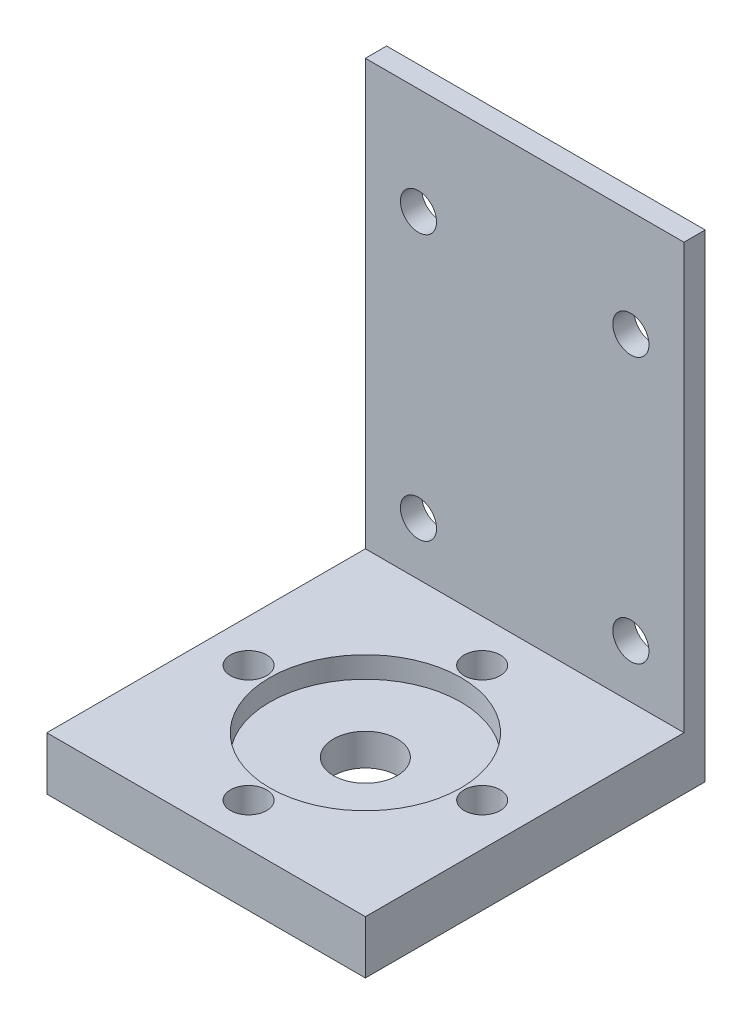
ISO-10303-21;
HEADER;
FILE_DESCRIPTION(('STEP AP214'),'2;1');
FILE_NAME('part.step','',(''),(''),'','','');
FILE_SCHEMA(('AUTOMOTIVE_DESIGN { 1 0 10303 214 1 1 1 1 }'));
ENDSEC;
DATA;
#1=APPLICATION_CONTEXT('core data for automotive mechanical design processes');
#2=APPLICATION_PROTOCOL_DEFINITION('international standard','automotive_design',2000,#1);
#3=PRODUCT_CONTEXT('',#1,'mechanical');
#4=PRODUCT('Part','Part','',(#3));
#5=PRODUCT_RELATED_PRODUCT_CATEGORY('part','',(#4));
#6=PRODUCT_DEFINITION_FORMATION('','',#4);
#7=PRODUCT_DEFINITION_CONTEXT('part definition',#1,'design');
#8=PRODUCT_DEFINITION('design','',#6,#7);
#9=PRODUCT_DEFINITION_SHAPE('','',#8);
#10=(LENGTH_UNIT() NAMED_UNIT(*) SI_UNIT(.MILLI.,.METRE.));
#11=(NAMED_UNIT(*) PLANE_ANGLE_UNIT() SI_UNIT($,.RADIAN.));
#12=(NAMED_UNIT(*) SI_UNIT($,.STERADIAN.) SOLID_ANGLE_UNIT());
#13=UNCERTAINTY_MEASURE_WITH_UNIT(LENGTH_MEASURE(1.E-05),#10,'distance_accuracy_value','');
#14=(GEOMETRIC_REPRESENTATION_CONTEXT(3) GLOBAL_UNCERTAINTY_ASSIGNED_CONTEXT((#13)) GLOBAL_UNIT_ASSIGNED_CONTEXT((#10,
#11,#12)) REPRESENTATION_CONTEXT('',''));
#15=CARTESIAN_POINT('',(0.,0.,0.));
#16=DIRECTION('',(0.,0.,1.));
#17=DIRECTION('',(1.,0.,0.));
#18=AXIS2_PLACEMENT_3D('',#15,#16,#17);
#19=CARTESIAN_POINT('',(30.,5.,0.));
#20=DIRECTION('',(0.,0.,-1.));
#21=DIRECTION('',(0.,1.,0.));
#22=AXIS2_PLACEMENT_3D('',#19,#20,#21);
#23=PLANE('',#22);
#24=DIRECTION('',(0.,-1.,0.));
#25=VECTOR('',#24,1.);
#26=CARTESIAN_POINT('',(0.,5.,0.));
#27=LINE('',#26,#25);
#28=CARTESIAN_POINT('',(0.,5.,0.));
#29=VERTEX_POINT('',#28);
#30=CARTESIAN_POINT('',(0.,0.,0.));
#31=VERTEX_POINT('',#30);
#32=EDGE_CURVE('E134',#29,#31,#27,.T.);
#33=ORIENTED_EDGE('',*,*,#32,.T.);
#34=DIRECTION('',(-1.,0.,0.));
#35=VECTOR('',#34,1.);
#36=CARTESIAN_POINT('',(30.,0.,0.));
#37=LINE('',#36,#35);
#38=CARTESIAN_POINT('',(30.,0.,0.));
#39=VERTEX_POINT('',#38);
#40=EDGE_CURVE('E11',#39,#31,#37,.T.);
#41=ORIENTED_EDGE('',*,*,#40,.F.);
#42=DIRECTION('',(0.,-1.,0.));
#43=VECTOR('',#42,1.);
#44=CARTESIAN_POINT('',(30.,5.,0.));
#45=LINE('',#44,#43);
#46=CARTESIAN_POINT('',(30.,5.,0.));
#47=VERTEX_POINT('',#46);
#48=EDGE_CURVE('E151',#47,#39,#45,.T.);
#49=ORIENTED_EDGE('',*,*,#48,.F.);
#50=DIRECTION('',(-1.,0.,0.));
#51=VECTOR('',#50,1.);
#52=CARTESIAN_POINT('',(30.,5.,0.));
#53=LINE('',#52,#51);
#54=EDGE_CURVE('E130',#47,#29,#53,.T.);
#55=ORIENTED_EDGE('',*,*,#54,.T.);
#56=EDGE_LOOP('',(#33,#41,#49,#55));
#57=FACE_BOUND('',#56,.T.);
#58=ADVANCED_FACE('F45',(#57),#23,.F.);
#59=CARTESIAN_POINT('',(30.,0.,0.));
#60=DIRECTION('',(0.,1.,0.));
#61=DIRECTION('',(0.,0.,1.));
#62=AXIS2_PLACEMENT_3D('',#59,#60,#61);
#63=PLANE('',#62);
#64=CARTESIAN_POINT('',(4.,0.,-15.));
#65=DIRECTION('',(0.,1.,0.));
#66=DIRECTION('',(0.,0.,1.));
#67=AXIS2_PLACEMENT_3D('',#64,#65,#66);
#68=CIRCLE('',#67,1.7);
#69=CARTESIAN_POINT('',(4.,0.,-13.3));
#70=VERTEX_POINT('',#69);
#71=EDGE_CURVE('E351',#70,#70,#68,.T.);
#72=ORIENTED_EDGE('',*,*,#71,.T.);
#73=EDGE_LOOP('',(#72));
#74=FACE_BOUND('',#73,.T.);
#75=CARTESIAN_POINT('',(15.,0.,-26.));
#76=DIRECTION('',(0.,1.,0.));
#77=DIRECTION('',(0.,0.,1.));
#78=AXIS2_PLACEMENT_3D('',#75,#76,#77);
#79=CIRCLE('',#78,1.7);
#80=CARTESIAN_POINT('',(15.,0.,-24.3));
#81=VERTEX_POINT('',#80);
#82=EDGE_CURVE('E355',#81,#81,#79,.T.);
#83=ORIENTED_EDGE('',*,*,#82,.T.);
#84=EDGE_LOOP('',(#83));
#85=FACE_BOUND('',#84,.T.);
#86=CARTESIAN_POINT('',(26.,0.,-15.));
#87=DIRECTION('',(0.,1.,0.));
#88=DIRECTION('',(0.,0.,1.));
#89=AXIS2_PLACEMENT_3D('',#86,#87,#88);
#90=CIRCLE('',#89,1.7);
#91=CARTESIAN_POINT('',(26.,0.,-13.3));
#92=VERTEX_POINT('',#91);
#93=EDGE_CURVE('E364',#92,#92,#90,.T.);
#94=ORIENTED_EDGE('',*,*,#93,.T.);
#95=EDGE_LOOP('',(#94));
#96=FACE_BOUND('',#95,.T.);
#97=CARTESIAN_POINT('',(15.,0.,-4.));
#98=DIRECTION('',(0.,1.,0.));
#99=DIRECTION('',(0.,0.,1.));
#100=AXIS2_PLACEMENT_3D('',#97,#98,#99);
#101=CIRCLE('',#100,1.7);
#102=CARTESIAN_POINT('',(15.,0.,-2.3));
#103=VERTEX_POINT('',#102);
#104=EDGE_CURVE('E372',#103,#103,#101,.T.);
#105=ORIENTED_EDGE('',*,*,#104,.T.);
#106=EDGE_LOOP('',(#105));
#107=FACE_BOUND('',#106,.T.);
#108=CARTESIAN_POINT('',(15.,0.,-15.));
#109=DIRECTION('',(0.,1.,0.));
#110=DIRECTION('',(0.,0.,1.));
#111=AXIS2_PLACEMENT_3D('',#108,#109,#110);
#112=CIRCLE('',#111,3.);
#113=CARTESIAN_POINT('',(15.,0.,-12.));
#114=VERTEX_POINT('',#113);
#115=EDGE_CURVE('E359',#114,#114,#112,.T.);
#116=ORIENTED_EDGE('',*,*,#115,.T.);
#117=EDGE_LOOP('',(#116));
#118=FACE_BOUND('',#117,.T.);
#119=DIRECTION('',(0.,0.,-1.));
#120=VECTOR('',#119,1.);
#121=CARTESIAN_POINT('',(0.,0.,0.));
#122=LINE('',#121,#120);
#123=CARTESIAN_POINT('',(0.,0.,-32.));
#124=VERTEX_POINT('',#123);
#125=EDGE_CURVE('E138',#31,#124,#122,.T.);
#126=ORIENTED_EDGE('',*,*,#125,.T.);
#127=DIRECTION('',(-1.,0.,0.));
#128=VECTOR('',#127,1.);
#129=CARTESIAN_POINT('',(30.,0.,-32.));
#130=LINE('',#129,#128);
#131=CARTESIAN_POINT('',(30.,0.,-32.));
#132=VERTEX_POINT('',#131);
#133=EDGE_CURVE('E54',#132,#124,#130,.T.);
#134=ORIENTED_EDGE('',*,*,#133,.F.);
#135=DIRECTION('',(0.,0.,-1.));
#136=VECTOR('',#135,1.);
#137=CARTESIAN_POINT('',(30.,0.,0.));
#138=LINE('',#137,#136);
#139=EDGE_CURVE('E99',#39,#132,#138,.T.);
#140=ORIENTED_EDGE('',*,*,#139,.F.);
#141=ORIENTED_EDGE('',*,*,#40,.T.);
#142=EDGE_LOOP('',(#126,#134,#140,#141));
#143=FACE_BOUND('',#142,.T.);
#144=ADVANCED_FACE('F185',(#74,#85,#96,#107,#118,#143),#63,.F.);
#145=CARTESIAN_POINT('',(30.,0.,-32.));
#146=DIRECTION('',(0.,0.,1.));
#147=DIRECTION('',(0.,-1.,0.));
#148=AXIS2_PLACEMENT_3D('',#145,#146,#147);
#149=PLANE('',#148);
#150=CARTESIAN_POINT('',(5.,10.,-32.));
#151=DIRECTION('',(0.,0.,1.));
#152=DIRECTION('',(1.,0.,0.));
#153=AXIS2_PLACEMENT_3D('',#150,#151,#152);
#154=CIRCLE('',#153,1.7);
#155=CARTESIAN_POINT('',(6.7,10.,-32.));
#156=VERTEX_POINT('',#155);
#157=EDGE_CURVE('E326',#156,#156,#154,.T.);
#158=ORIENTED_EDGE('',*,*,#157,.T.);
#159=EDGE_LOOP('',(#158));
#160=FACE_BOUND('',#159,.T.);
#161=CARTESIAN_POINT('',(25.,10.,-32.));
#162=DIRECTION('',(0.,0.,1.));
#163=DIRECTION('',(1.,0.,0.));
#164=AXIS2_PLACEMENT_3D('',#161,#162,#163);
#165=CIRCLE('',#164,1.7);
#166=CARTESIAN_POINT('',(26.7,10.,-32.));
#167=VERTEX_POINT('',#166);
#168=EDGE_CURVE('E331',#167,#167,#165,.T.);
#169=ORIENTED_EDGE('',*,*,#168,.T.);
#170=EDGE_LOOP('',(#169));
#171=FACE_BOUND('',#170,.T.);
#172=CARTESIAN_POINT('',(25.,35.,-32.));
#173=DIRECTION('',(0.,0.,1.));
#174=DIRECTION('',(1.,0.,0.));
#175=AXIS2_PLACEMENT_3D('',#172,#173,#174);
#176=CIRCLE('',#175,1.7);
#177=CARTESIAN_POINT('',(26.7,35.,-32.));
#178=VERTEX_POINT('',#177);
#179=EDGE_CURVE('E403',#178,#178,#176,.T.);
#180=ORIENTED_EDGE('',*,*,#179,.T.);
#181=EDGE_LOOP('',(#180));
#182=FACE_BOUND('',#181,.T.);
#183=CARTESIAN_POINT('',(5.,35.,-32.));
#184=DIRECTION('',(0.,0.,1.));
#185=DIRECTION('',(1.,0.,0.));
#186=AXIS2_PLACEMENT_3D('',#183,#184,#185);
#187=CIRCLE('',#186,1.7);
#188=CARTESIAN_POINT('',(6.7,35.,-32.));
#189=VERTEX_POINT('',#188);
#190=EDGE_CURVE('E341',#189,#189,#187,.T.);
#191=ORIENTED_EDGE('',*,*,#190,.T.);
#192=EDGE_LOOP('',(#191));
#193=FACE_BOUND('',#192,.T.);
#194=DIRECTION('',(0.,1.,0.));
#195=VECTOR('',#194,1.);
#196=CARTESIAN_POINT('',(0.,0.,-32.));
#197=LINE('',#196,#195);
#198=CARTESIAN_POINT('',(0.,45.,-32.));
#199=VERTEX_POINT('',#198);
#200=EDGE_CURVE('E142',#124,#199,#197,.T.);
#201=ORIENTED_EDGE('',*,*,#200,.T.);
#202=DIRECTION('',(-1.,0.,0.));
#203=VECTOR('',#202,1.);
#204=CARTESIAN_POINT('',(30.,45.,-32.));
#205=LINE('',#204,#203);
#206=CARTESIAN_POINT('',(30.,45.,-32.));
#207=VERTEX_POINT('',#206);
#208=EDGE_CURVE('E123',#207,#199,#205,.T.);
#209=ORIENTED_EDGE('',*,*,#208,.F.);
#210=DIRECTION('',(0.,1.,0.));
#211=VECTOR('',#210,1.);
#212=CARTESIAN_POINT('',(30.,0.,-32.));
#213=LINE('',#212,#211);
#214=EDGE_CURVE('E112',#132,#207,#213,.T.);
#215=ORIENTED_EDGE('',*,*,#214,.F.);
#216=ORIENTED_EDGE('',*,*,#133,.T.);
#217=EDGE_LOOP('',(#201,#209,#215,#216));
#218=FACE_BOUND('',#217,.T.);
#219=ADVANCED_FACE('F161',(#160,#171,#182,#193,#218),#149,.F.);
#220=CARTESIAN_POINT('',(30.,45.,-32.));
#221=DIRECTION('',(0.,-1.,0.));
#222=DIRECTION('',(0.,0.,-1.));
#223=AXIS2_PLACEMENT_3D('',#220,#221,#222);
#224=PLANE('',#223);
#225=DIRECTION('',(0.,0.,1.));
#226=VECTOR('',#225,1.);
#227=CARTESIAN_POINT('',(0.,45.,-32.));
#228=LINE('',#227,#226);
#229=CARTESIAN_POINT('',(0.,45.,-30.));
#230=VERTEX_POINT('',#229);
#231=EDGE_CURVE('E121',#199,#230,#228,.T.);
#232=ORIENTED_EDGE('',*,*,#231,.T.);
#233=DIRECTION('',(-1.,0.,0.));
#234=VECTOR('',#233,1.);
#235=CARTESIAN_POINT('',(30.,45.,-30.));
#236=LINE('',#235,#234);
#237=CARTESIAN_POINT('',(30.,45.,-30.));
#238=VERTEX_POINT('',#237);
#239=EDGE_CURVE('E118',#238,#230,#236,.T.);
#240=ORIENTED_EDGE('',*,*,#239,.F.);
#241=DIRECTION('',(0.,0.,1.));
#242=VECTOR('',#241,1.);
#243=CARTESIAN_POINT('',(30.,45.,-32.));
#244=LINE('',#243,#242);
#245=EDGE_CURVE('E106',#207,#238,#244,.T.);
#246=ORIENTED_EDGE('',*,*,#245,.F.);
#247=ORIENTED_EDGE('',*,*,#208,.T.);
#248=EDGE_LOOP('',(#232,#240,#246,#247));
#249=FACE_BOUND('',#248,.T.);
#250=ADVANCED_FACE('F119',(#249),#224,.F.);
#251=CARTESIAN_POINT('',(30.,45.,-30.));
#252=DIRECTION('',(0.,0.,-1.));
#253=DIRECTION('',(0.,1.,0.));
#254=AXIS2_PLACEMENT_3D('',#251,#252,#253);
#255=PLANE('',#254);
#256=CARTESIAN_POINT('',(5.,10.,-30.));
#257=DIRECTION('',(0.,0.,1.));
#258=DIRECTION('',(1.,0.,0.));
#259=AXIS2_PLACEMENT_3D('',#256,#257,#258);
#260=CIRCLE('',#259,1.7);
#261=CARTESIAN_POINT('',(6.7,10.,-30.));
#262=VERTEX_POINT('',#261);
#263=EDGE_CURVE('E329',#262,#262,#260,.T.);
#264=ORIENTED_EDGE('',*,*,#263,.F.);
#265=EDGE_LOOP('',(#264));
#266=FACE_BOUND('',#265,.T.);
#267=CARTESIAN_POINT('',(25.,10.,-30.));
#268=DIRECTION('',(0.,0.,1.));
#269=DIRECTION('',(1.,0.,0.));
#270=AXIS2_PLACEMENT_3D('',#267,#268,#269);
#271=CIRCLE('',#270,1.7);
#272=CARTESIAN_POINT('',(26.7,10.,-30.));
#273=VERTEX_POINT('',#272);
#274=EDGE_CURVE('E336',#273,#273,#271,.T.);
#275=ORIENTED_EDGE('',*,*,#274,.F.);
#276=EDGE_LOOP('',(#275));
#277=FACE_BOUND('',#276,.T.);
#278=CARTESIAN_POINT('',(25.,35.,-30.));
#279=DIRECTION('',(0.,0.,1.));
#280=DIRECTION('',(1.,0.,0.));
#281=AXIS2_PLACEMENT_3D('',#278,#279,#280);
#282=CIRCLE('',#281,1.7);
#283=CARTESIAN_POINT('',(26.7,35.,-30.));
#284=VERTEX_POINT('',#283);
#285=EDGE_CURVE('E350',#284,#284,#282,.T.);
#286=ORIENTED_EDGE('',*,*,#285,.F.);
#287=EDGE_LOOP('',(#286));
#288=FACE_BOUND('',#287,.T.);
#289=CARTESIAN_POINT('',(5.,35.,-30.));
#290=DIRECTION('',(0.,0.,1.));
#291=DIRECTION('',(1.,0.,0.));
#292=AXIS2_PLACEMENT_3D('',#289,#290,#291);
#293=CIRCLE('',#292,1.7);
#294=CARTESIAN_POINT('',(6.7,35.,-30.));
#295=VERTEX_POINT('',#294);
#296=EDGE_CURVE('E346',#295,#295,#293,.T.);
#297=ORIENTED_EDGE('',*,*,#296,.F.);
#298=EDGE_LOOP('',(#297));
#299=FACE_BOUND('',#298,.T.);
#300=DIRECTION('',(0.,-1.,0.));
#301=VECTOR('',#300,1.);
#302=CARTESIAN_POINT('',(0.,45.,-30.));
#303=LINE('',#302,#301);
#304=CARTESIAN_POINT('',(0.,5.,-30.));
#305=VERTEX_POINT('',#304);
#306=EDGE_CURVE('E85',#230,#305,#303,.T.);
#307=ORIENTED_EDGE('',*,*,#306,.T.);
#308=DIRECTION('',(-1.,0.,0.));
#309=VECTOR('',#308,1.);
#310=CARTESIAN_POINT('',(30.,5.,-30.));
#311=LINE('',#310,#309);
#312=CARTESIAN_POINT('',(30.,5.,-30.));
#313=VERTEX_POINT('',#312);
#314=EDGE_CURVE('E124',#313,#305,#311,.T.);
#315=ORIENTED_EDGE('',*,*,#314,.F.);
#316=DIRECTION('',(0.,-1.,0.));
#317=VECTOR('',#316,1.);
#318=CARTESIAN_POINT('',(30.,45.,-30.));
#319=LINE('',#318,#317);
#320=EDGE_CURVE('E110',#238,#313,#319,.T.);
#321=ORIENTED_EDGE('',*,*,#320,.F.);
#322=ORIENTED_EDGE('',*,*,#239,.T.);
#323=EDGE_LOOP('',(#307,#315,#321,#322));
#324=FACE_BOUND('',#323,.T.);
#325=ADVANCED_FACE('F126',(#266,#277,#288,#299,#324),#255,.F.);
#326=CARTESIAN_POINT('',(30.,5.,-30.));
#327=DIRECTION('',(0.,-1.,0.));
#328=DIRECTION('',(0.,0.,-1.));
#329=AXIS2_PLACEMENT_3D('',#326,#327,#328);
#330=PLANE('',#329);
#331=CARTESIAN_POINT('',(4.,5.,-15.));
#332=DIRECTION('',(0.,1.,0.));
#333=DIRECTION('',(0.,0.,1.));
#334=AXIS2_PLACEMENT_3D('',#331,#332,#333);
#335=CIRCLE('',#334,1.7);
#336=CARTESIAN_POINT('',(4.,5.,-13.3));
#337=VERTEX_POINT('',#336);
#338=EDGE_CURVE('E354',#337,#337,#335,.T.);
#339=ORIENTED_EDGE('',*,*,#338,.F.);
#340=EDGE_LOOP('',(#339));
#341=FACE_BOUND('',#340,.T.);
#342=CARTESIAN_POINT('',(15.,5.,-26.));
#343=DIRECTION('',(0.,1.,0.));
#344=DIRECTION('',(0.,0.,1.));
#345=AXIS2_PLACEMENT_3D('',#342,#343,#344);
#346=CIRCLE('',#345,1.7);
#347=CARTESIAN_POINT('',(15.,5.,-24.3));
#348=VERTEX_POINT('',#347);
#349=EDGE_CURVE('E360',#348,#348,#346,.T.);
#350=ORIENTED_EDGE('',*,*,#349,.F.);
#351=EDGE_LOOP('',(#350));
#352=FACE_BOUND('',#351,.T.);
#353=CARTESIAN_POINT('',(26.,5.,-15.));
#354=DIRECTION('',(0.,1.,0.));
#355=DIRECTION('',(0.,0.,1.));
#356=AXIS2_PLACEMENT_3D('',#353,#354,#355);
#357=CIRCLE('',#356,1.7);
#358=CARTESIAN_POINT('',(26.,5.,-13.3));
#359=VERTEX_POINT('',#358);
#360=EDGE_CURVE('E368',#359,#359,#357,.T.);
#361=ORIENTED_EDGE('',*,*,#360,.F.);
#362=EDGE_LOOP('',(#361));
#363=FACE_BOUND('',#362,.T.);
#364=CARTESIAN_POINT('',(15.,5.,-4.));
#365=DIRECTION('',(0.,1.,0.));
#366=DIRECTION('',(0.,0.,1.));
#367=AXIS2_PLACEMENT_3D('',#364,#365,#366);
#368=CIRCLE('',#367,1.7);
#369=CARTESIAN_POINT('',(15.,5.,-2.3));
#370=VERTEX_POINT('',#369);
#371=EDGE_CURVE('E345',#370,#370,#368,.T.);
#372=ORIENTED_EDGE('',*,*,#371,.F.);
#373=EDGE_LOOP('',(#372));
#374=FACE_BOUND('',#373,.T.);
#375=CARTESIAN_POINT('',(15.,5.,-15.));
#376=DIRECTION('',(0.,1.,0.));
#377=DIRECTION('',(0.,0.,1.));
#378=AXIS2_PLACEMENT_3D('',#375,#376,#377);
#379=CIRCLE('',#378,9.);
#380=CARTESIAN_POINT('',(15.,5.,-6.));
#381=VERTEX_POINT('',#380);
#382=EDGE_CURVE('E389',#381,#381,#379,.T.);
#383=ORIENTED_EDGE('',*,*,#382,.F.);
#384=EDGE_LOOP('',(#383));
#385=FACE_BOUND('',#384,.T.);
#386=DIRECTION('',(0.,0.,1.));
#387=VECTOR('',#386,1.);
#388=CARTESIAN_POINT('',(0.,5.,-30.));
#389=LINE('',#388,#387);
#390=EDGE_CURVE('E91',#305,#29,#389,.T.);
#391=ORIENTED_EDGE('',*,*,#390,.T.);
#392=ORIENTED_EDGE('',*,*,#54,.F.);
#393=DIRECTION('',(0.,0.,1.));
#394=VECTOR('',#393,1.);
#395=CARTESIAN_POINT('',(30.,5.,-30.));
#396=LINE('',#395,#394);
#397=EDGE_CURVE('E62',#313,#47,#396,.T.);
#398=ORIENTED_EDGE('',*,*,#397,.F.);
#399=ORIENTED_EDGE('',*,*,#314,.T.);
#400=EDGE_LOOP('',(#391,#392,#398,#399));
#401=FACE_BOUND('',#400,.T.);
#402=ADVANCED_FACE('F168',(#341,#352,#363,#374,#385,#401),#330,.F.);
#403=CARTESIAN_POINT('',(30.,0.,0.));
#404=DIRECTION('',(1.,0.,0.));
#405=DIRECTION('',(0.,0.,-1.));
#406=AXIS2_PLACEMENT_3D('',#403,#404,#405);
#407=PLANE('',#406);
#408=ORIENTED_EDGE('',*,*,#48,.T.);
#409=ORIENTED_EDGE('',*,*,#139,.T.);
#410=ORIENTED_EDGE('',*,*,#214,.T.);
#411=ORIENTED_EDGE('',*,*,#245,.T.);
#412=ORIENTED_EDGE('',*,*,#320,.T.);
#413=ORIENTED_EDGE('',*,*,#397,.T.);
#414=EDGE_LOOP('',(#408,#409,#410,#411,#412,#413));
#415=FACE_BOUND('',#414,.T.);
#416=ADVANCED_FACE('F108',(#415),#407,.T.);
#417=CARTESIAN_POINT('',(0.,0.,0.));
#418=DIRECTION('',(1.,0.,0.));
#419=DIRECTION('',(0.,0.,-1.));
#420=AXIS2_PLACEMENT_3D('',#417,#418,#419);
#421=PLANE('',#420);
#422=ORIENTED_EDGE('',*,*,#32,.F.);
#423=ORIENTED_EDGE('',*,*,#390,.F.);
#424=ORIENTED_EDGE('',*,*,#306,.F.);
#425=ORIENTED_EDGE('',*,*,#231,.F.);
#426=ORIENTED_EDGE('',*,*,#200,.F.);
#427=ORIENTED_EDGE('',*,*,#125,.F.);
#428=EDGE_LOOP('',(#422,#423,#424,#425,#426,#427));
#429=FACE_BOUND('',#428,.T.);
#430=ADVANCED_FACE('F164',(#429),#421,.F.);
#431=CARTESIAN_POINT('',(15.,3.,-15.));
#432=DIRECTION('',(0.,1.,0.));
#433=DIRECTION('',(0.,0.,1.));
#434=AXIS2_PLACEMENT_3D('',#431,#432,#433);
#435=CYLINDRICAL_SURFACE('',#434,9.);
#436=CARTESIAN_POINT('',(15.,3.,-15.));
#437=DIRECTION('',(0.,1.,0.));
#438=DIRECTION('',(0.,0.,1.));
#439=AXIS2_PLACEMENT_3D('',#436,#437,#438);
#440=CIRCLE('',#439,9.);
#441=CARTESIAN_POINT('',(15.,3.,-6.));
#442=VERTEX_POINT('',#441);
#443=EDGE_CURVE('E139',#442,#442,#440,.T.);
#444=ORIENTED_EDGE('',*,*,#443,.F.);
#445=EDGE_LOOP('',(#444));
#446=FACE_BOUND('',#445,.T.);
#447=ORIENTED_EDGE('',*,*,#382,.T.);
#448=EDGE_LOOP('',(#447));
#449=FACE_BOUND('',#448,.T.);
#450=ADVANCED_FACE('F215',(#446,#449),#435,.F.);
#451=CARTESIAN_POINT('',(15.,3.,-15.));
#452=DIRECTION('',(0.,1.,0.));
#453=DIRECTION('',(0.,0.,1.));
#454=AXIS2_PLACEMENT_3D('',#451,#452,#453);
#455=PLANE('',#454);
#456=CARTESIAN_POINT('',(15.,3.,-15.));
#457=DIRECTION('',(0.,1.,0.));
#458=DIRECTION('',(0.,0.,1.));
#459=AXIS2_PLACEMENT_3D('',#456,#457,#458);
#460=CIRCLE('',#459,3.);
#461=CARTESIAN_POINT('',(15.,3.,-12.));
#462=VERTEX_POINT('',#461);
#463=EDGE_CURVE('E385',#462,#462,#460,.T.);
#464=ORIENTED_EDGE('',*,*,#463,.F.);
#465=EDGE_LOOP('',(#464));
#466=FACE_BOUND('',#465,.T.);
#467=ORIENTED_EDGE('',*,*,#443,.T.);
#468=EDGE_LOOP('',(#467));
#469=FACE_BOUND('',#468,.T.);
#470=ADVANCED_FACE('F222',(#466,#469),#455,.T.);
#471=CARTESIAN_POINT('',(15.,0.,-15.));
#472=DIRECTION('',(0.,1.,0.));
#473=DIRECTION('',(0.,0.,1.));
#474=AXIS2_PLACEMENT_3D('',#471,#472,#473);
#475=CYLINDRICAL_SURFACE('',#474,3.);
#476=ORIENTED_EDGE('',*,*,#463,.T.);
#477=EDGE_LOOP('',(#476));
#478=FACE_BOUND('',#477,.T.);
#479=ORIENTED_EDGE('',*,*,#115,.F.);
#480=EDGE_LOOP('',(#479));
#481=FACE_BOUND('',#480,.T.);
#482=ADVANCED_FACE('F230',(#478,#481),#475,.F.);
#483=CARTESIAN_POINT('',(15.,5.,-4.));
#484=DIRECTION('',(0.,-1.,0.));
#485=DIRECTION('',(0.,0.,-1.));
#486=AXIS2_PLACEMENT_3D('',#483,#484,#485);
#487=CYLINDRICAL_SURFACE('',#486,1.7);
#488=ORIENTED_EDGE('',*,*,#371,.T.);
#489=EDGE_LOOP('',(#488));
#490=FACE_BOUND('',#489,.T.);
#491=ORIENTED_EDGE('',*,*,#104,.F.);
#492=EDGE_LOOP('',(#491));
#493=FACE_BOUND('',#492,.T.);
#494=ADVANCED_FACE('F238',(#490,#493),#487,.F.);
#495=CARTESIAN_POINT('',(26.,5.,-15.));
#496=DIRECTION('',(0.,-1.,0.));
#497=DIRECTION('',(0.,0.,-1.));
#498=AXIS2_PLACEMENT_3D('',#495,#496,#497);
#499=CYLINDRICAL_SURFACE('',#498,1.7);
#500=ORIENTED_EDGE('',*,*,#360,.T.);
#501=EDGE_LOOP('',(#500));
#502=FACE_BOUND('',#501,.T.);
#503=ORIENTED_EDGE('',*,*,#93,.F.);
#504=EDGE_LOOP('',(#503));
#505=FACE_BOUND('',#504,.T.);
#506=ADVANCED_FACE('F250',(#502,#505),#499,.F.);
#507=CARTESIAN_POINT('',(15.,5.,-26.));
#508=DIRECTION('',(0.,-1.,0.));
#509=DIRECTION('',(0.,0.,-1.));
#510=AXIS2_PLACEMENT_3D('',#507,#508,#509);
#511=CYLINDRICAL_SURFACE('',#510,1.7);
#512=ORIENTED_EDGE('',*,*,#349,.T.);
#513=EDGE_LOOP('',(#512));
#514=FACE_BOUND('',#513,.T.);
#515=ORIENTED_EDGE('',*,*,#82,.F.);
#516=EDGE_LOOP('',(#515));
#517=FACE_BOUND('',#516,.T.);
#518=ADVANCED_FACE('F260',(#514,#517),#511,.F.);
#519=CARTESIAN_POINT('',(4.,5.,-15.));
#520=DIRECTION('',(0.,-1.,0.));
#521=DIRECTION('',(0.,0.,-1.));
#522=AXIS2_PLACEMENT_3D('',#519,#520,#521);
#523=CYLINDRICAL_SURFACE('',#522,1.7);
#524=ORIENTED_EDGE('',*,*,#338,.T.);
#525=EDGE_LOOP('',(#524));
#526=FACE_BOUND('',#525,.T.);
#527=ORIENTED_EDGE('',*,*,#71,.F.);
#528=EDGE_LOOP('',(#527));
#529=FACE_BOUND('',#528,.T.);
#530=ADVANCED_FACE('F270',(#526,#529),#523,.F.);
#531=CARTESIAN_POINT('',(5.,35.,-32.));
#532=DIRECTION('',(0.,0.,1.));
#533=DIRECTION('',(1.,0.,0.));
#534=AXIS2_PLACEMENT_3D('',#531,#532,#533);
#535=CYLINDRICAL_SURFACE('',#534,1.7);
#536=ORIENTED_EDGE('',*,*,#190,.F.);
#537=EDGE_LOOP('',(#536));
#538=FACE_BOUND('',#537,.T.);
#539=ORIENTED_EDGE('',*,*,#296,.T.);
#540=EDGE_LOOP('',(#539));
#541=FACE_BOUND('',#540,.T.);
#542=ADVANCED_FACE('F280',(#538,#541),#535,.F.);
#543=CARTESIAN_POINT('',(25.,35.,-32.));
#544=DIRECTION('',(0.,0.,1.));
#545=DIRECTION('',(1.,0.,0.));
#546=AXIS2_PLACEMENT_3D('',#543,#544,#545);
#547=CYLINDRICAL_SURFACE('',#546,1.7);
#548=ORIENTED_EDGE('',*,*,#179,.F.);
#549=EDGE_LOOP('',(#548));
#550=FACE_BOUND('',#549,.T.);
#551=ORIENTED_EDGE('',*,*,#285,.T.);
#552=EDGE_LOOP('',(#551));
#553=FACE_BOUND('',#552,.T.);
#554=ADVANCED_FACE('F290',(#550,#553),#547,.F.);
#555=CARTESIAN_POINT('',(25.,10.,-32.));
#556=DIRECTION('',(0.,0.,1.));
#557=DIRECTION('',(1.,0.,0.));
#558=AXIS2_PLACEMENT_3D('',#555,#556,#557);
#559=CYLINDRICAL_SURFACE('',#558,1.7);
#560=ORIENTED_EDGE('',*,*,#168,.F.);
#561=EDGE_LOOP('',(#560));
#562=FACE_BOUND('',#561,.T.);
#563=ORIENTED_EDGE('',*,*,#274,.T.);
#564=EDGE_LOOP('',(#563));
#565=FACE_BOUND('',#564,.T.);
#566=ADVANCED_FACE('F300',(#562,#565),#559,.F.);
#567=CARTESIAN_POINT('',(5.,10.,-32.));
#568=DIRECTION('',(0.,0.,1.));
#569=DIRECTION('',(1.,0.,0.));
#570=AXIS2_PLACEMENT_3D('',#567,#568,#569);
#571=CYLINDRICAL_SURFACE('',#570,1.7);
#572=ORIENTED_EDGE('',*,*,#157,.F.);
#573=EDGE_LOOP('',(#572));
#574=FACE_BOUND('',#573,.T.);
#575=ORIENTED_EDGE('',*,*,#263,.T.);
#576=EDGE_LOOP('',(#575));
#577=FACE_BOUND('',#576,.T.);
#578=ADVANCED_FACE('F310',(#574,#577),#571,.F.);
#579=CLOSED_SHELL('',(#58,#144,#219,#250,#325,#402,#416,#430,#450,#470,#482,#494,#506,#518,#530,
#542,#554,#566,#578));
#580=MANIFOLD_SOLID_BREP('B2',#579);
#581=ADVANCED_BREP_SHAPE_REPRESENTATION('',(#18,#580),#14);
#582=SHAPE_DEFINITION_REPRESENTATION(#9,#581);
ENDSEC;
END-ISO-10303-21;
